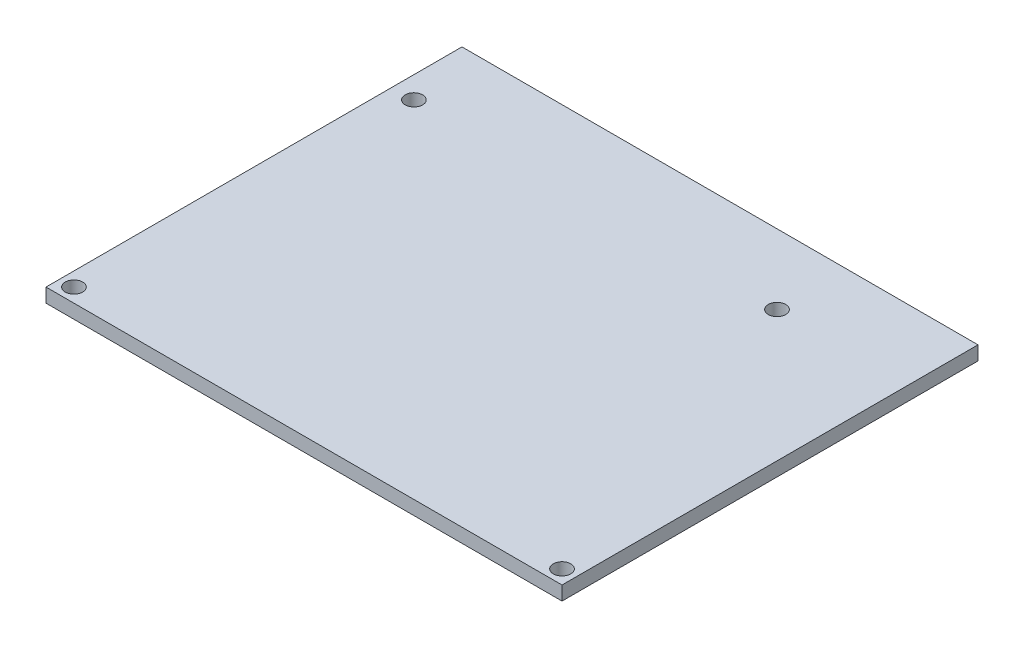
ISO-10303-21;
HEADER;
FILE_DESCRIPTION(('STEP AP214'),'2;1');
FILE_NAME('part.step','',(''),(''),'','','');
FILE_SCHEMA(('AUTOMOTIVE_DESIGN { 1 0 10303 214 1 1 1 1 }'));
ENDSEC;
DATA;
#1=APPLICATION_CONTEXT('core data for automotive mechanical design processes');
#2=APPLICATION_PROTOCOL_DEFINITION('international standard','automotive_design',2000,#1);
#3=PRODUCT_CONTEXT('',#1,'mechanical');
#4=PRODUCT('Part','Part','',(#3));
#5=PRODUCT_RELATED_PRODUCT_CATEGORY('part','',(#4));
#6=PRODUCT_DEFINITION_FORMATION('','',#4);
#7=PRODUCT_DEFINITION_CONTEXT('part definition',#1,'design');
#8=PRODUCT_DEFINITION('design','',#6,#7);
#9=PRODUCT_DEFINITION_SHAPE('','',#8);
#10=(LENGTH_UNIT() NAMED_UNIT(*) SI_UNIT(.MILLI.,.METRE.));
#11=(NAMED_UNIT(*) PLANE_ANGLE_UNIT() SI_UNIT($,.RADIAN.));
#12=(NAMED_UNIT(*) SI_UNIT($,.STERADIAN.) SOLID_ANGLE_UNIT());
#13=UNCERTAINTY_MEASURE_WITH_UNIT(LENGTH_MEASURE(1.E-05),#10,'distance_accuracy_value','');
#14=(GEOMETRIC_REPRESENTATION_CONTEXT(3) GLOBAL_UNCERTAINTY_ASSIGNED_CONTEXT((#13)) GLOBAL_UNIT_ASSIGNED_CONTEXT((#10,
#11,#12)) REPRESENTATION_CONTEXT('',''));
#15=CARTESIAN_POINT('',(0.,0.,0.));
#16=DIRECTION('',(0.,0.,1.));
#17=DIRECTION('',(1.,0.,0.));
#18=AXIS2_PLACEMENT_3D('',#15,#16,#17);
#19=CARTESIAN_POINT('',(0.,1.6,0.));
#20=DIRECTION('',(0.,-1.,0.));
#21=DIRECTION('',(0.,0.,-1.));
#22=AXIS2_PLACEMENT_3D('',#19,#20,#21);
#23=PLANE('',#22);
#24=DIRECTION('',(0.,0.,1.));
#25=VECTOR('',#24,1.);
#26=CARTESIAN_POINT('',(0.,1.6,0.));
#27=LINE('',#26,#25);
#28=CARTESIAN_POINT('',(0.,1.6,-47.6));
#29=VERTEX_POINT('',#28);
#30=CARTESIAN_POINT('',(0.,1.6,0.));
#31=VERTEX_POINT('',#30);
#32=EDGE_CURVE('E85',#29,#31,#27,.T.);
#33=ORIENTED_EDGE('',*,*,#32,.T.);
#34=DIRECTION('',(1.,0.,0.));
#35=VECTOR('',#34,1.);
#36=CARTESIAN_POINT('',(0.,1.6,0.));
#37=LINE('',#36,#35);
#38=CARTESIAN_POINT('',(59.05,1.6,0.));
#39=VERTEX_POINT('',#38);
#40=EDGE_CURVE('E80',#31,#39,#37,.T.);
#41=ORIENTED_EDGE('',*,*,#40,.T.);
#42=DIRECTION('',(0.,0.,-1.));
#43=VECTOR('',#42,1.);
#44=CARTESIAN_POINT('',(59.05,1.6,0.));
#45=LINE('',#44,#43);
#46=CARTESIAN_POINT('',(59.05,1.6,-47.6));
#47=VERTEX_POINT('',#46);
#48=EDGE_CURVE('E83',#39,#47,#45,.T.);
#49=ORIENTED_EDGE('',*,*,#48,.T.);
#50=DIRECTION('',(-1.,0.,0.));
#51=VECTOR('',#50,1.);
#52=CARTESIAN_POINT('',(0.,1.6,-47.6));
#53=LINE('',#52,#51);
#54=EDGE_CURVE('E50',#47,#29,#53,.T.);
#55=ORIENTED_EDGE('',*,*,#54,.T.);
#56=EDGE_LOOP('',(#33,#41,#49,#55));
#57=FACE_BOUND('',#56,.T.);
#58=CARTESIAN_POINT('',(57.45,1.6,-1.6));
#59=DIRECTION('',(0.,1.,0.));
#60=DIRECTION('',(0.,0.,1.));
#61=AXIS2_PLACEMENT_3D('',#58,#59,#60);
#62=CIRCLE('',#61,0.999999999999998);
#63=CARTESIAN_POINT('',(57.45,1.6,-0.600000000000002));
#64=VERTEX_POINT('',#63);
#65=EDGE_CURVE('E100',#64,#64,#62,.T.);
#66=ORIENTED_EDGE('',*,*,#65,.F.);
#67=EDGE_LOOP('',(#66));
#68=FACE_BOUND('',#67,.T.);
#69=CARTESIAN_POINT('',(44.05,1.6,-39.6));
#70=DIRECTION('',(0.,1.,0.));
#71=DIRECTION('',(0.,0.,1.));
#72=AXIS2_PLACEMENT_3D('',#69,#70,#71);
#73=CIRCLE('',#72,0.999999999999998);
#74=CARTESIAN_POINT('',(44.05,1.6,-38.6));
#75=VERTEX_POINT('',#74);
#76=EDGE_CURVE('E115',#75,#75,#73,.T.);
#77=ORIENTED_EDGE('',*,*,#76,.F.);
#78=EDGE_LOOP('',(#77));
#79=FACE_BOUND('',#78,.T.);
#80=CARTESIAN_POINT('',(2.5,1.6,-39.6));
#81=DIRECTION('',(0.,1.,0.));
#82=DIRECTION('',(0.,0.,1.));
#83=AXIS2_PLACEMENT_3D('',#80,#81,#82);
#84=CIRCLE('',#83,1.);
#85=CARTESIAN_POINT('',(2.5,1.6,-38.6));
#86=VERTEX_POINT('',#85);
#87=EDGE_CURVE('E121',#86,#86,#84,.T.);
#88=ORIENTED_EDGE('',*,*,#87,.F.);
#89=EDGE_LOOP('',(#88));
#90=FACE_BOUND('',#89,.T.);
#91=CARTESIAN_POINT('',(1.6,1.6,-1.6));
#92=DIRECTION('',(0.,1.,0.));
#93=DIRECTION('',(0.,0.,1.));
#94=AXIS2_PLACEMENT_3D('',#91,#92,#93);
#95=CIRCLE('',#94,1.);
#96=CARTESIAN_POINT('',(1.6,1.6,-0.6));
#97=VERTEX_POINT('',#96);
#98=EDGE_CURVE('E127',#97,#97,#95,.T.);
#99=ORIENTED_EDGE('',*,*,#98,.F.);
#100=EDGE_LOOP('',(#99));
#101=FACE_BOUND('',#100,.T.);
#102=ADVANCED_FACE('F33',(#57,#68,#79,#90,#101),#23,.F.);
#103=CARTESIAN_POINT('',(0.,0.,0.));
#104=DIRECTION('',(0.,-1.,0.));
#105=DIRECTION('',(0.,0.,-1.));
#106=AXIS2_PLACEMENT_3D('',#103,#104,#105);
#107=PLANE('',#106);
#108=CARTESIAN_POINT('',(2.5,0.,-39.6));
#109=DIRECTION('',(0.,1.,0.));
#110=DIRECTION('',(0.,0.,1.));
#111=AXIS2_PLACEMENT_3D('',#108,#109,#110);
#112=CIRCLE('',#111,1.);
#113=CARTESIAN_POINT('',(2.5,0.,-38.6));
#114=VERTEX_POINT('',#113);
#115=EDGE_CURVE('E124',#114,#114,#112,.T.);
#116=ORIENTED_EDGE('',*,*,#115,.T.);
#117=EDGE_LOOP('',(#116));
#118=FACE_BOUND('',#117,.T.);
#119=CARTESIAN_POINT('',(57.45,0.,-1.6));
#120=DIRECTION('',(0.,1.,0.));
#121=DIRECTION('',(0.,0.,1.));
#122=AXIS2_PLACEMENT_3D('',#119,#120,#121);
#123=CIRCLE('',#122,0.999999999999998);
#124=CARTESIAN_POINT('',(57.45,0.,-0.600000000000002));
#125=VERTEX_POINT('',#124);
#126=EDGE_CURVE('E112',#125,#125,#123,.T.);
#127=ORIENTED_EDGE('',*,*,#126,.T.);
#128=EDGE_LOOP('',(#127));
#129=FACE_BOUND('',#128,.T.);
#130=DIRECTION('',(0.,0.,1.));
#131=VECTOR('',#130,1.);
#132=CARTESIAN_POINT('',(0.,0.,0.));
#133=LINE('',#132,#131);
#134=CARTESIAN_POINT('',(0.,0.,-47.6));
#135=VERTEX_POINT('',#134);
#136=CARTESIAN_POINT('',(0.,0.,0.));
#137=VERTEX_POINT('',#136);
#138=EDGE_CURVE('E97',#135,#137,#133,.T.);
#139=ORIENTED_EDGE('',*,*,#138,.F.);
#140=DIRECTION('',(-1.,0.,0.));
#141=VECTOR('',#140,1.);
#142=CARTESIAN_POINT('',(0.,0.,-47.6));
#143=LINE('',#142,#141);
#144=CARTESIAN_POINT('',(59.05,0.,-47.6));
#145=VERTEX_POINT('',#144);
#146=EDGE_CURVE('E73',#145,#135,#143,.T.);
#147=ORIENTED_EDGE('',*,*,#146,.F.);
#148=DIRECTION('',(0.,0.,-1.));
#149=VECTOR('',#148,1.);
#150=CARTESIAN_POINT('',(59.05,0.,0.));
#151=LINE('',#150,#149);
#152=CARTESIAN_POINT('',(59.05,0.,0.));
#153=VERTEX_POINT('',#152);
#154=EDGE_CURVE('E67',#153,#145,#151,.T.);
#155=ORIENTED_EDGE('',*,*,#154,.F.);
#156=DIRECTION('',(1.,0.,0.));
#157=VECTOR('',#156,1.);
#158=CARTESIAN_POINT('',(0.,0.,0.));
#159=LINE('',#158,#157);
#160=EDGE_CURVE('E89',#137,#153,#159,.T.);
#161=ORIENTED_EDGE('',*,*,#160,.F.);
#162=EDGE_LOOP('',(#139,#147,#155,#161));
#163=FACE_BOUND('',#162,.T.);
#164=CARTESIAN_POINT('',(44.05,0.,-39.6));
#165=DIRECTION('',(0.,1.,0.));
#166=DIRECTION('',(0.,0.,1.));
#167=AXIS2_PLACEMENT_3D('',#164,#165,#166);
#168=CIRCLE('',#167,0.999999999999998);
#169=CARTESIAN_POINT('',(44.05,0.,-38.6));
#170=VERTEX_POINT('',#169);
#171=EDGE_CURVE('E118',#170,#170,#168,.T.);
#172=ORIENTED_EDGE('',*,*,#171,.T.);
#173=EDGE_LOOP('',(#172));
#174=FACE_BOUND('',#173,.T.);
#175=CARTESIAN_POINT('',(1.6,0.,-1.6));
#176=DIRECTION('',(0.,1.,0.));
#177=DIRECTION('',(0.,0.,1.));
#178=AXIS2_PLACEMENT_3D('',#175,#176,#177);
#179=CIRCLE('',#178,1.);
#180=CARTESIAN_POINT('',(1.6,0.,-0.6));
#181=VERTEX_POINT('',#180);
#182=EDGE_CURVE('E130',#181,#181,#179,.T.);
#183=ORIENTED_EDGE('',*,*,#182,.T.);
#184=EDGE_LOOP('',(#183));
#185=FACE_BOUND('',#184,.T.);
#186=ADVANCED_FACE('F108',(#118,#129,#163,#174,#185),#107,.T.);
#187=CARTESIAN_POINT('',(0.,1.6,0.));
#188=DIRECTION('',(1.,0.,0.));
#189=DIRECTION('',(0.,0.,-1.));
#190=AXIS2_PLACEMENT_3D('',#187,#188,#189);
#191=PLANE('',#190);
#192=ORIENTED_EDGE('',*,*,#138,.T.);
#193=DIRECTION('',(0.,-1.,0.));
#194=VECTOR('',#193,1.);
#195=CARTESIAN_POINT('',(0.,1.6,0.));
#196=LINE('',#195,#194);
#197=EDGE_CURVE('E11',#31,#137,#196,.T.);
#198=ORIENTED_EDGE('',*,*,#197,.F.);
#199=ORIENTED_EDGE('',*,*,#32,.F.);
#200=DIRECTION('',(0.,-1.,0.));
#201=VECTOR('',#200,1.);
#202=CARTESIAN_POINT('',(0.,1.6,-47.6));
#203=LINE('',#202,#201);
#204=EDGE_CURVE('E93',#29,#135,#203,.T.);
#205=ORIENTED_EDGE('',*,*,#204,.T.);
#206=EDGE_LOOP('',(#192,#198,#199,#205));
#207=FACE_BOUND('',#206,.T.);
#208=ADVANCED_FACE('F35',(#207),#191,.F.);
#209=CARTESIAN_POINT('',(0.,1.6,0.));
#210=DIRECTION('',(0.,0.,-1.));
#211=DIRECTION('',(-1.,0.,0.));
#212=AXIS2_PLACEMENT_3D('',#209,#210,#211);
#213=PLANE('',#212);
#214=ORIENTED_EDGE('',*,*,#160,.T.);
#215=DIRECTION('',(0.,-1.,0.));
#216=VECTOR('',#215,1.);
#217=CARTESIAN_POINT('',(59.05,1.6,0.));
#218=LINE('',#217,#216);
#219=EDGE_CURVE('E42',#39,#153,#218,.T.);
#220=ORIENTED_EDGE('',*,*,#219,.F.);
#221=ORIENTED_EDGE('',*,*,#40,.F.);
#222=ORIENTED_EDGE('',*,*,#197,.T.);
#223=EDGE_LOOP('',(#214,#220,#221,#222));
#224=FACE_BOUND('',#223,.T.);
#225=ADVANCED_FACE('F88',(#224),#213,.F.);
#226=CARTESIAN_POINT('',(59.05,1.6,0.));
#227=DIRECTION('',(-1.,0.,0.));
#228=DIRECTION('',(0.,0.,1.));
#229=AXIS2_PLACEMENT_3D('',#226,#227,#228);
#230=PLANE('',#229);
#231=ORIENTED_EDGE('',*,*,#154,.T.);
#232=DIRECTION('',(0.,-1.,0.));
#233=VECTOR('',#232,1.);
#234=CARTESIAN_POINT('',(59.05,1.6,-47.6));
#235=LINE('',#234,#233);
#236=EDGE_CURVE('E90',#47,#145,#235,.T.);
#237=ORIENTED_EDGE('',*,*,#236,.F.);
#238=ORIENTED_EDGE('',*,*,#48,.F.);
#239=ORIENTED_EDGE('',*,*,#219,.T.);
#240=EDGE_LOOP('',(#231,#237,#238,#239));
#241=FACE_BOUND('',#240,.T.);
#242=ADVANCED_FACE('F91',(#241),#230,.F.);
#243=CARTESIAN_POINT('',(0.,1.6,-47.6));
#244=DIRECTION('',(0.,0.,1.));
#245=DIRECTION('',(1.,0.,0.));
#246=AXIS2_PLACEMENT_3D('',#243,#244,#245);
#247=PLANE('',#246);
#248=ORIENTED_EDGE('',*,*,#146,.T.);
#249=ORIENTED_EDGE('',*,*,#204,.F.);
#250=ORIENTED_EDGE('',*,*,#54,.F.);
#251=ORIENTED_EDGE('',*,*,#236,.T.);
#252=EDGE_LOOP('',(#248,#249,#250,#251));
#253=FACE_BOUND('',#252,.T.);
#254=ADVANCED_FACE('F105',(#253),#247,.F.);
#255=CARTESIAN_POINT('',(57.45,1.6,-1.6));
#256=DIRECTION('',(0.,-1.,0.));
#257=DIRECTION('',(0.,0.,-1.));
#258=AXIS2_PLACEMENT_3D('',#255,#256,#257);
#259=CYLINDRICAL_SURFACE('',#258,0.999999999999998);
#260=ORIENTED_EDGE('',*,*,#65,.T.);
#261=EDGE_LOOP('',(#260));
#262=FACE_BOUND('',#261,.T.);
#263=ORIENTED_EDGE('',*,*,#126,.F.);
#264=EDGE_LOOP('',(#263));
#265=FACE_BOUND('',#264,.T.);
#266=ADVANCED_FACE('F147',(#262,#265),#259,.F.);
#267=CARTESIAN_POINT('',(44.05,1.6,-39.6));
#268=DIRECTION('',(0.,-1.,0.));
#269=DIRECTION('',(0.,0.,-1.));
#270=AXIS2_PLACEMENT_3D('',#267,#268,#269);
#271=CYLINDRICAL_SURFACE('',#270,0.999999999999998);
#272=ORIENTED_EDGE('',*,*,#76,.T.);
#273=EDGE_LOOP('',(#272));
#274=FACE_BOUND('',#273,.T.);
#275=ORIENTED_EDGE('',*,*,#171,.F.);
#276=EDGE_LOOP('',(#275));
#277=FACE_BOUND('',#276,.T.);
#278=ADVANCED_FACE('F193',(#274,#277),#271,.F.);
#279=CARTESIAN_POINT('',(2.5,1.6,-39.6));
#280=DIRECTION('',(0.,-1.,0.));
#281=DIRECTION('',(0.,0.,-1.));
#282=AXIS2_PLACEMENT_3D('',#279,#280,#281);
#283=CYLINDRICAL_SURFACE('',#282,1.);
#284=ORIENTED_EDGE('',*,*,#87,.T.);
#285=EDGE_LOOP('',(#284));
#286=FACE_BOUND('',#285,.T.);
#287=ORIENTED_EDGE('',*,*,#115,.F.);
#288=EDGE_LOOP('',(#287));
#289=FACE_BOUND('',#288,.T.);
#290=ADVANCED_FACE('F201',(#286,#289),#283,.F.);
#291=CARTESIAN_POINT('',(1.6,1.6,-1.6));
#292=DIRECTION('',(0.,-1.,0.));
#293=DIRECTION('',(0.,0.,-1.));
#294=AXIS2_PLACEMENT_3D('',#291,#292,#293);
#295=CYLINDRICAL_SURFACE('',#294,1.);
#296=ORIENTED_EDGE('',*,*,#98,.T.);
#297=EDGE_LOOP('',(#296));
#298=FACE_BOUND('',#297,.T.);
#299=ORIENTED_EDGE('',*,*,#182,.F.);
#300=EDGE_LOOP('',(#299));
#301=FACE_BOUND('',#300,.T.);
#302=ADVANCED_FACE('F136',(#298,#301),#295,.F.);
#303=CLOSED_SHELL('',(#102,#186,#208,#225,#242,#254,#266,#278,#290,#302));
#304=MANIFOLD_SOLID_BREP('B2',#303);
#305=ADVANCED_BREP_SHAPE_REPRESENTATION('',(#18,#304),#14);
#306=SHAPE_DEFINITION_REPRESENTATION(#9,#305);
ENDSEC;
END-ISO-10303-21;
